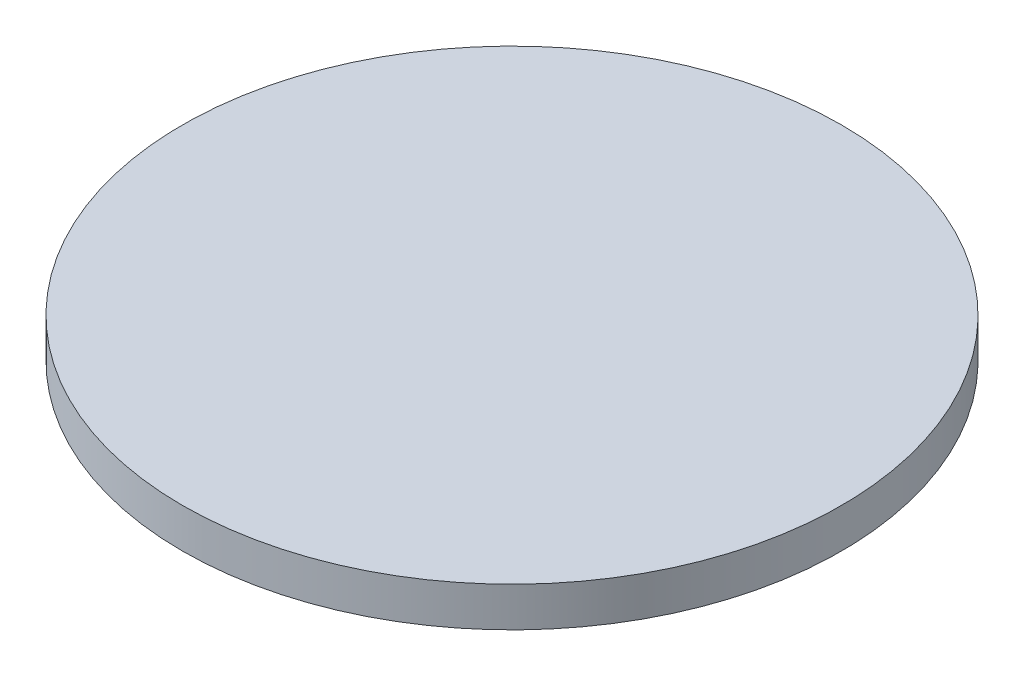
ISO-10303-21;
HEADER;
FILE_DESCRIPTION(('STEP AP214'),'2;1');
FILE_NAME('part.step','',(''),(''),'','','');
FILE_SCHEMA(('AUTOMOTIVE_DESIGN { 1 0 10303 214 1 1 1 1 }'));
ENDSEC;
DATA;
#1=APPLICATION_CONTEXT('core data for automotive mechanical design processes');
#2=APPLICATION_PROTOCOL_DEFINITION('international standard','automotive_design',2000,#1);
#3=PRODUCT_CONTEXT('',#1,'mechanical');
#4=PRODUCT('Part','Part','',(#3));
#5=PRODUCT_RELATED_PRODUCT_CATEGORY('part','',(#4));
#6=PRODUCT_DEFINITION_FORMATION('','',#4);
#7=PRODUCT_DEFINITION_CONTEXT('part definition',#1,'design');
#8=PRODUCT_DEFINITION('design','',#6,#7);
#9=PRODUCT_DEFINITION_SHAPE('','',#8);
#10=(LENGTH_UNIT() NAMED_UNIT(*) SI_UNIT(.MILLI.,.METRE.));
#11=(NAMED_UNIT(*) PLANE_ANGLE_UNIT() SI_UNIT($,.RADIAN.));
#12=(NAMED_UNIT(*) SI_UNIT($,.STERADIAN.) SOLID_ANGLE_UNIT());
#13=UNCERTAINTY_MEASURE_WITH_UNIT(LENGTH_MEASURE(1.E-05),#10,'distance_accuracy_value','');
#14=(GEOMETRIC_REPRESENTATION_CONTEXT(3) GLOBAL_UNCERTAINTY_ASSIGNED_CONTEXT((#13)) GLOBAL_UNIT_ASSIGNED_CONTEXT((#10,
#11,#12)) REPRESENTATION_CONTEXT('',''));
#15=CARTESIAN_POINT('',(0.,0.,0.));
#16=DIRECTION('',(0.,0.,1.));
#17=DIRECTION('',(1.,0.,0.));
#18=AXIS2_PLACEMENT_3D('',#15,#16,#17);
#19=CARTESIAN_POINT('',(0.,1.5,0.));
#20=DIRECTION('',(0.,-1.,0.));
#21=DIRECTION('',(0.,0.,-1.));
#22=AXIS2_PLACEMENT_3D('',#19,#20,#21);
#23=CYLINDRICAL_SURFACE('',#22,12.5);
#24=CARTESIAN_POINT('',(0.,1.5,0.));
#25=DIRECTION('',(0.,1.,0.));
#26=DIRECTION('',(0.,0.,1.));
#27=AXIS2_PLACEMENT_3D('',#24,#25,#26);
#28=CIRCLE('',#27,12.5);
#29=CARTESIAN_POINT('',(0.,1.5,12.5));
#30=VERTEX_POINT('',#29);
#31=EDGE_CURVE('E10',#30,#30,#28,.T.);
#32=ORIENTED_EDGE('',*,*,#31,.F.);
#33=EDGE_LOOP('',(#32));
#34=FACE_BOUND('',#33,.T.);
#35=CARTESIAN_POINT('',(0.,0.,0.));
#36=DIRECTION('',(0.,1.,0.));
#37=DIRECTION('',(0.,0.,1.));
#38=AXIS2_PLACEMENT_3D('',#35,#36,#37);
#39=CIRCLE('',#38,12.5);
#40=CARTESIAN_POINT('',(0.,0.,12.5));
#41=VERTEX_POINT('',#40);
#42=EDGE_CURVE('E34',#41,#41,#39,.T.);
#43=ORIENTED_EDGE('',*,*,#42,.T.);
#44=EDGE_LOOP('',(#43));
#45=FACE_BOUND('',#44,.T.);
#46=ADVANCED_FACE('F31',(#34,#45),#23,.T.);
#47=CARTESIAN_POINT('',(0.,1.5,0.));
#48=DIRECTION('',(0.,1.,0.));
#49=DIRECTION('',(0.,0.,1.));
#50=AXIS2_PLACEMENT_3D('',#47,#48,#49);
#51=PLANE('',#50);
#52=ORIENTED_EDGE('',*,*,#31,.T.);
#53=EDGE_LOOP('',(#52));
#54=FACE_BOUND('',#53,.T.);
#55=ADVANCED_FACE('F46',(#54),#51,.T.);
#56=CARTESIAN_POINT('',(0.,0.,0.));
#57=DIRECTION('',(0.,1.,0.));
#58=DIRECTION('',(0.,0.,1.));
#59=AXIS2_PLACEMENT_3D('',#56,#57,#58);
#60=PLANE('',#59);
#61=ORIENTED_EDGE('',*,*,#42,.F.);
#62=EDGE_LOOP('',(#61));
#63=FACE_BOUND('',#62,.T.);
#64=ADVANCED_FACE('F44',(#63),#60,.F.);
#65=CLOSED_SHELL('',(#46,#55,#64));
#66=MANIFOLD_SOLID_BREP('B2',#65);
#67=ADVANCED_BREP_SHAPE_REPRESENTATION('',(#18,#66),#14);
#68=SHAPE_DEFINITION_REPRESENTATION(#9,#67);
ENDSEC;
END-ISO-10303-21;
